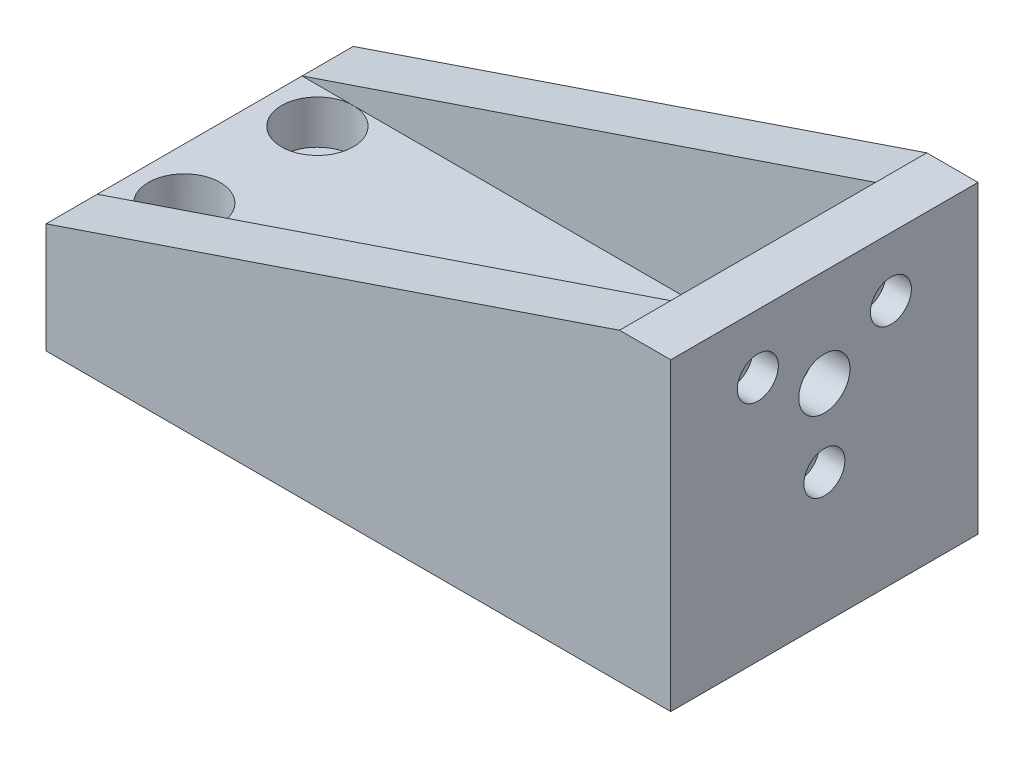
ISO-10303-21;
HEADER;
FILE_DESCRIPTION(('STEP AP214'),'2;1');
FILE_NAME('part.step','',(''),(''),'','','');
FILE_SCHEMA(('AUTOMOTIVE_DESIGN { 1 0 10303 214 1 1 1 1 }'));
ENDSEC;
DATA;
#1=APPLICATION_CONTEXT('core data for automotive mechanical design processes');
#2=APPLICATION_PROTOCOL_DEFINITION('international standard','automotive_design',2000,#1);
#3=PRODUCT_CONTEXT('',#1,'mechanical');
#4=PRODUCT('Part','Part','',(#3));
#5=PRODUCT_RELATED_PRODUCT_CATEGORY('part','',(#4));
#6=PRODUCT_DEFINITION_FORMATION('','',#4);
#7=PRODUCT_DEFINITION_CONTEXT('part definition',#1,'design');
#8=PRODUCT_DEFINITION('design','',#6,#7);
#9=PRODUCT_DEFINITION_SHAPE('','',#8);
#10=(LENGTH_UNIT() NAMED_UNIT(*) SI_UNIT(.MILLI.,.METRE.));
#11=(NAMED_UNIT(*) PLANE_ANGLE_UNIT() SI_UNIT($,.RADIAN.));
#12=(NAMED_UNIT(*) SI_UNIT($,.STERADIAN.) SOLID_ANGLE_UNIT());
#13=UNCERTAINTY_MEASURE_WITH_UNIT(LENGTH_MEASURE(1.E-05),#10,'distance_accuracy_value','');
#14=(GEOMETRIC_REPRESENTATION_CONTEXT(3) GLOBAL_UNCERTAINTY_ASSIGNED_CONTEXT((#13)) GLOBAL_UNIT_ASSIGNED_CONTEXT((#10,
#11,#12)) REPRESENTATION_CONTEXT('',''));
#15=CARTESIAN_POINT('',(0.,0.,0.));
#16=DIRECTION('',(0.,0.,1.));
#17=DIRECTION('',(1.,0.,0.));
#18=AXIS2_PLACEMENT_3D('',#15,#16,#17);
#19=CARTESIAN_POINT('',(-5.,0.,0.));
#20=DIRECTION('',(1.,0.,0.));
#21=DIRECTION('',(0.,0.,-1.));
#22=AXIS2_PLACEMENT_3D('',#19,#20,#21);
#23=CYLINDRICAL_SURFACE('',#22,2.5);
#24=CARTESIAN_POINT('',(0.,0.,0.));
#25=DIRECTION('',(1.,0.,0.));
#26=DIRECTION('',(0.,0.,-1.));
#27=AXIS2_PLACEMENT_3D('',#24,#25,#26);
#28=CIRCLE('',#27,2.5);
#29=CARTESIAN_POINT('',(0.,0.,-2.5));
#30=VERTEX_POINT('',#29);
#31=EDGE_CURVE('E166',#30,#30,#28,.T.);
#32=ORIENTED_EDGE('',*,*,#31,.T.);
#33=EDGE_LOOP('',(#32));
#34=FACE_BOUND('',#33,.T.);
#35=CARTESIAN_POINT('',(-3.5,0.,0.));
#36=DIRECTION('',(-1.,0.,0.));
#37=DIRECTION('',(0.,0.,1.));
#38=AXIS2_PLACEMENT_3D('',#35,#36,#37);
#39=CIRCLE('',#38,2.5);
#40=CARTESIAN_POINT('',(-3.5,0.,2.5));
#41=VERTEX_POINT('',#40);
#42=EDGE_CURVE('E43',#41,#41,#39,.F.);
#43=ORIENTED_EDGE('',*,*,#42,.F.);
#44=EDGE_LOOP('',(#43));
#45=FACE_BOUND('',#44,.T.);
#46=ADVANCED_FACE('F39',(#34,#45),#23,.F.);
#47=CARTESIAN_POINT('',(-5.,0.,0.));
#48=DIRECTION('',(-1.,0.,0.));
#49=DIRECTION('',(0.,0.,1.));
#50=AXIS2_PLACEMENT_3D('',#47,#48,#49);
#51=PLANE('',#50);
#52=CARTESIAN_POINT('',(-5.,0.,0.));
#53=DIRECTION('',(-1.,0.,0.));
#54=DIRECTION('',(0.,0.,1.));
#55=AXIS2_PLACEMENT_3D('',#52,#53,#54);
#56=CIRCLE('',#55,6.25);
#57=CARTESIAN_POINT('',(-5.,0.,6.25));
#58=VERTEX_POINT('',#57);
#59=EDGE_CURVE('E691',#58,#58,#56,.T.);
#60=ORIENTED_EDGE('',*,*,#59,.F.);
#61=EDGE_LOOP('',(#60));
#62=FACE_BOUND('',#61,.T.);
#63=CARTESIAN_POINT('',(-5.,3.75000000000008,6.49519052838324));
#64=DIRECTION('',(1.,0.,0.));
#65=DIRECTION('',(0.,0.,-1.));
#66=AXIS2_PLACEMENT_3D('',#63,#64,#65);
#67=CIRCLE('',#66,1.);
#68=CARTESIAN_POINT('',(-5.,3.75000000000008,5.49519052838324));
#69=VERTEX_POINT('',#68);
#70=EDGE_CURVE('E197',#69,#69,#67,.T.);
#71=ORIENTED_EDGE('',*,*,#70,.T.);
#72=EDGE_LOOP('',(#71));
#73=FACE_BOUND('',#72,.T.);
#74=CARTESIAN_POINT('',(-5.,-7.5,0.));
#75=DIRECTION('',(1.,0.,0.));
#76=DIRECTION('',(0.,0.,-1.));
#77=AXIS2_PLACEMENT_3D('',#74,#75,#76);
#78=CIRCLE('',#77,1.);
#79=CARTESIAN_POINT('',(-5.,-7.5,-0.999999999999948));
#80=VERTEX_POINT('',#79);
#81=EDGE_CURVE('E202',#80,#80,#78,.T.);
#82=ORIENTED_EDGE('',*,*,#81,.T.);
#83=EDGE_LOOP('',(#82));
#84=FACE_BOUND('',#83,.T.);
#85=CARTESIAN_POINT('',(-5.,3.74999999999998,-6.4951905283833));
#86=DIRECTION('',(1.,0.,0.));
#87=DIRECTION('',(0.,0.,-1.));
#88=AXIS2_PLACEMENT_3D('',#85,#86,#87);
#89=CIRCLE('',#88,1.);
#90=CARTESIAN_POINT('',(-5.,3.74999999999998,-7.4951905283833));
#91=VERTEX_POINT('',#90);
#92=EDGE_CURVE('E208',#91,#91,#89,.T.);
#93=ORIENTED_EDGE('',*,*,#92,.T.);
#94=EDGE_LOOP('',(#93));
#95=FACE_BOUND('',#94,.T.);
#96=DIRECTION('',(0.,0.,-1.));
#97=VECTOR('',#96,1.);
#98=CARTESIAN_POINT('',(-5.,-9.5,-15.));
#99=LINE('',#98,#97);
#100=CARTESIAN_POINT('',(-5.,-9.5,10.));
#101=VERTEX_POINT('',#100);
#102=CARTESIAN_POINT('',(-5.,-9.5,-10.));
#103=VERTEX_POINT('',#102);
#104=EDGE_CURVE('E148',#101,#103,#99,.T.);
#105=ORIENTED_EDGE('',*,*,#104,.F.);
#106=DIRECTION('',(0.,-1.,0.));
#107=VECTOR('',#106,1.);
#108=CARTESIAN_POINT('',(-5.,9.5,10.));
#109=LINE('',#108,#107);
#110=CARTESIAN_POINT('',(-5.,9.5,10.));
#111=VERTEX_POINT('',#110);
#112=EDGE_CURVE('E120',#111,#101,#109,.T.);
#113=ORIENTED_EDGE('',*,*,#112,.F.);
#114=DIRECTION('',(0.,0.,1.));
#115=VECTOR('',#114,1.);
#116=CARTESIAN_POINT('',(-5.,9.5,15.));
#117=LINE('',#116,#115);
#118=CARTESIAN_POINT('',(-5.,9.5,-10.));
#119=VERTEX_POINT('',#118);
#120=EDGE_CURVE('E146',#119,#111,#117,.T.);
#121=ORIENTED_EDGE('',*,*,#120,.F.);
#122=DIRECTION('',(0.,-1.,0.));
#123=VECTOR('',#122,1.);
#124=CARTESIAN_POINT('',(-5.,9.5,-10.));
#125=LINE('',#124,#123);
#126=EDGE_CURVE('E666',#119,#103,#125,.T.);
#127=ORIENTED_EDGE('',*,*,#126,.T.);
#128=EDGE_LOOP('',(#105,#113,#121,#127));
#129=FACE_BOUND('',#128,.T.);
#130=ADVANCED_FACE('F144',(#62,#73,#84,#95,#129),#51,.T.);
#131=CARTESIAN_POINT('',(-61.,-9.5,-15.));
#132=DIRECTION('',(0.,-1.,0.));
#133=DIRECTION('',(0.,0.,-1.));
#134=AXIS2_PLACEMENT_3D('',#131,#132,#133);
#135=PLANE('',#134);
#136=DIRECTION('',(-1.,0.,0.));
#137=VECTOR('',#136,1.);
#138=CARTESIAN_POINT('',(-5.,-9.5,-10.));
#139=LINE('',#138,#137);
#140=CARTESIAN_POINT('',(-11.,-9.5,-10.));
#141=VERTEX_POINT('',#140);
#142=CARTESIAN_POINT('',(-56.,-9.5,-10.));
#143=VERTEX_POINT('',#142);
#144=EDGE_CURVE('E655',#141,#143,#139,.T.);
#145=ORIENTED_EDGE('',*,*,#144,.T.);
#146=CARTESIAN_POINT('',(-56.,-9.5,-6.5));
#147=DIRECTION('',(0.,1.,0.));
#148=DIRECTION('',(0.,0.,1.));
#149=AXIS2_PLACEMENT_3D('',#146,#147,#148);
#150=CIRCLE('',#149,3.5);
#151=EDGE_CURVE('E55',#143,#143,#150,.T.);
#152=ORIENTED_EDGE('',*,*,#151,.F.);
#153=CARTESIAN_POINT('',(-61.,-9.5,-10.));
#154=VERTEX_POINT('',#153);
#155=EDGE_CURVE('E661',#143,#154,#139,.T.);
#156=ORIENTED_EDGE('',*,*,#155,.T.);
#157=DIRECTION('',(0.,0.,-1.));
#158=VECTOR('',#157,1.);
#159=CARTESIAN_POINT('',(-61.,-9.5,-15.));
#160=LINE('',#159,#158);
#161=CARTESIAN_POINT('',(-61.,-9.5,10.));
#162=VERTEX_POINT('',#161);
#163=EDGE_CURVE('E264',#162,#154,#160,.T.);
#164=ORIENTED_EDGE('',*,*,#163,.F.);
#165=DIRECTION('',(-1.,0.,0.));
#166=VECTOR('',#165,1.);
#167=CARTESIAN_POINT('',(-5.,-9.5,10.));
#168=LINE('',#167,#166);
#169=CARTESIAN_POINT('',(-56.,-9.5,10.));
#170=VERTEX_POINT('',#169);
#171=EDGE_CURVE('E124',#170,#162,#168,.T.);
#172=ORIENTED_EDGE('',*,*,#171,.F.);
#173=CARTESIAN_POINT('',(-56.,-9.5,6.5));
#174=DIRECTION('',(0.,1.,0.));
#175=DIRECTION('',(0.,0.,-1.));
#176=AXIS2_PLACEMENT_3D('',#173,#174,#175);
#177=CIRCLE('',#176,3.5);
#178=EDGE_CURVE('E705',#170,#170,#177,.T.);
#179=ORIENTED_EDGE('',*,*,#178,.F.);
#180=CARTESIAN_POINT('',(-11.,-9.5,10.));
#181=VERTEX_POINT('',#180);
#182=EDGE_CURVE('E679',#181,#170,#168,.T.);
#183=ORIENTED_EDGE('',*,*,#182,.F.);
#184=CARTESIAN_POINT('',(-11.,-9.5,6.5));
#185=DIRECTION('',(0.,1.,0.));
#186=DIRECTION('',(0.,0.,-1.));
#187=AXIS2_PLACEMENT_3D('',#184,#185,#186);
#188=CIRCLE('',#187,3.5);
#189=EDGE_CURVE('E677',#181,#181,#188,.T.);
#190=ORIENTED_EDGE('',*,*,#189,.F.);
#191=EDGE_CURVE('E139',#101,#181,#168,.T.);
#192=ORIENTED_EDGE('',*,*,#191,.F.);
#193=ORIENTED_EDGE('',*,*,#104,.T.);
#194=EDGE_CURVE('E660',#103,#141,#139,.T.);
#195=ORIENTED_EDGE('',*,*,#194,.T.);
#196=CARTESIAN_POINT('',(-11.,-9.5,-6.5));
#197=DIRECTION('',(0.,1.,0.));
#198=DIRECTION('',(0.,0.,1.));
#199=AXIS2_PLACEMENT_3D('',#196,#197,#198);
#200=CIRCLE('',#199,3.5);
#201=EDGE_CURVE('E60',#141,#141,#200,.T.);
#202=ORIENTED_EDGE('',*,*,#201,.F.);
#203=EDGE_LOOP('',(#145,#152,#156,#164,#172,#179,#183,#190,#192,#193,#195,#202));
#204=FACE_BOUND('',#203,.T.);
#205=ADVANCED_FACE('F314',(#204),#135,.F.);
#206=CARTESIAN_POINT('',(-5.,3.74999999999998,-6.4951905283833));
#207=DIRECTION('',(1.,0.,0.));
#208=DIRECTION('',(0.,0.,-1.));
#209=AXIS2_PLACEMENT_3D('',#206,#207,#208);
#210=CYLINDRICAL_SURFACE('',#209,1.);
#211=ORIENTED_EDGE('',*,*,#92,.F.);
#212=EDGE_LOOP('',(#211));
#213=FACE_BOUND('',#212,.T.);
#214=CARTESIAN_POINT('',(-2.5,3.74999999999998,-6.4951905283833));
#215=DIRECTION('',(1.,0.,0.));
#216=DIRECTION('',(0.,0.,-1.));
#217=AXIS2_PLACEMENT_3D('',#214,#215,#216);
#218=CIRCLE('',#217,1.);
#219=CARTESIAN_POINT('',(-2.5,3.74999999999998,-7.4951905283833));
#220=VERTEX_POINT('',#219);
#221=EDGE_CURVE('E194',#220,#220,#218,.F.);
#222=ORIENTED_EDGE('',*,*,#221,.F.);
#223=EDGE_LOOP('',(#222));
#224=FACE_BOUND('',#223,.T.);
#225=ADVANCED_FACE('F318',(#213,#224),#210,.F.);
#226=CARTESIAN_POINT('',(-5.,-7.5,0.));
#227=DIRECTION('',(1.,0.,0.));
#228=DIRECTION('',(0.,0.,-1.));
#229=AXIS2_PLACEMENT_3D('',#226,#227,#228);
#230=CYLINDRICAL_SURFACE('',#229,1.);
#231=ORIENTED_EDGE('',*,*,#81,.F.);
#232=EDGE_LOOP('',(#231));
#233=FACE_BOUND('',#232,.T.);
#234=CARTESIAN_POINT('',(-2.5,-7.5,0.));
#235=DIRECTION('',(1.,0.,0.));
#236=DIRECTION('',(0.,0.,-1.));
#237=AXIS2_PLACEMENT_3D('',#234,#235,#236);
#238=CIRCLE('',#237,1.);
#239=CARTESIAN_POINT('',(-2.5,-7.5,-0.999999999999948));
#240=VERTEX_POINT('',#239);
#241=EDGE_CURVE('E190',#240,#240,#238,.F.);
#242=ORIENTED_EDGE('',*,*,#241,.F.);
#243=EDGE_LOOP('',(#242));
#244=FACE_BOUND('',#243,.T.);
#245=ADVANCED_FACE('F597',(#233,#244),#230,.F.);
#246=CARTESIAN_POINT('',(-5.,3.75000000000008,6.49519052838324));
#247=DIRECTION('',(1.,0.,0.));
#248=DIRECTION('',(0.,0.,-1.));
#249=AXIS2_PLACEMENT_3D('',#246,#247,#248);
#250=CYLINDRICAL_SURFACE('',#249,1.);
#251=ORIENTED_EDGE('',*,*,#70,.F.);
#252=EDGE_LOOP('',(#251));
#253=FACE_BOUND('',#252,.T.);
#254=CARTESIAN_POINT('',(-2.5,3.75000000000008,6.49519052838324));
#255=DIRECTION('',(1.,0.,0.));
#256=DIRECTION('',(0.,0.,-1.));
#257=AXIS2_PLACEMENT_3D('',#254,#255,#256);
#258=CIRCLE('',#257,1.);
#259=CARTESIAN_POINT('',(-2.5,3.75000000000008,5.49519052838324));
#260=VERTEX_POINT('',#259);
#261=EDGE_CURVE('E186',#260,#260,#258,.F.);
#262=ORIENTED_EDGE('',*,*,#261,.F.);
#263=EDGE_LOOP('',(#262));
#264=FACE_BOUND('',#263,.T.);
#265=ADVANCED_FACE('F384',(#253,#264),#250,.F.);
#266=CARTESIAN_POINT('',(-5.,-20.25,-15.));
#267=DIRECTION('',(0.,0.,-1.));
#268=DIRECTION('',(0.,1.,0.));
#269=AXIS2_PLACEMENT_3D('',#266,#267,#268);
#270=PLANE('',#269);
#271=DIRECTION('',(0.946978700315083,0.32129634474976,0.));
#272=VECTOR('',#271,1.);
#273=CARTESIAN_POINT('',(-61.,-9.5,-15.));
#274=LINE('',#273,#272);
#275=CARTESIAN_POINT('',(-61.,-9.5,-15.));
#276=VERTEX_POINT('',#275);
#277=CARTESIAN_POINT('',(-5.,9.5,-15.));
#278=VERTEX_POINT('',#277);
#279=EDGE_CURVE('E138',#276,#278,#274,.T.);
#280=ORIENTED_EDGE('',*,*,#279,.T.);
#281=DIRECTION('',(1.,0.,0.));
#282=VECTOR('',#281,1.);
#283=CARTESIAN_POINT('',(-5.,9.5,-15.));
#284=LINE('',#283,#282);
#285=CARTESIAN_POINT('',(0.,9.5,-15.));
#286=VERTEX_POINT('',#285);
#287=EDGE_CURVE('E160',#278,#286,#284,.T.);
#288=ORIENTED_EDGE('',*,*,#287,.T.);
#289=DIRECTION('',(0.,1.,0.));
#290=VECTOR('',#289,1.);
#291=CARTESIAN_POINT('',(0.,-20.25,-15.));
#292=LINE('',#291,#290);
#293=CARTESIAN_POINT('',(0.,-20.25,-15.));
#294=VERTEX_POINT('',#293);
#295=EDGE_CURVE('E168',#294,#286,#292,.T.);
#296=ORIENTED_EDGE('',*,*,#295,.F.);
#297=DIRECTION('',(1.,0.,0.));
#298=VECTOR('',#297,1.);
#299=CARTESIAN_POINT('',(-5.,-20.25,-15.));
#300=LINE('',#299,#298);
#301=CARTESIAN_POINT('',(-61.,-20.25,-15.));
#302=VERTEX_POINT('',#301);
#303=EDGE_CURVE('E11',#302,#294,#300,.T.);
#304=ORIENTED_EDGE('',*,*,#303,.F.);
#305=DIRECTION('',(0.,-1.,0.));
#306=VECTOR('',#305,1.);
#307=CARTESIAN_POINT('',(-61.,-20.25,-15.));
#308=LINE('',#307,#306);
#309=EDGE_CURVE('E248',#276,#302,#308,.T.);
#310=ORIENTED_EDGE('',*,*,#309,.F.);
#311=EDGE_LOOP('',(#280,#288,#296,#304,#310));
#312=FACE_BOUND('',#311,.T.);
#313=ADVANCED_FACE('F41',(#312),#270,.T.);
#314=CARTESIAN_POINT('',(-5.,-20.25,15.));
#315=DIRECTION('',(0.,-1.,0.));
#316=DIRECTION('',(0.,0.,-1.));
#317=AXIS2_PLACEMENT_3D('',#314,#315,#316);
#318=PLANE('',#317);
#319=CARTESIAN_POINT('',(-55.9999999999999,-20.25,6.5));
#320=DIRECTION('',(0.,-1.,0.));
#321=DIRECTION('',(0.,0.,-1.));
#322=AXIS2_PLACEMENT_3D('',#319,#320,#321);
#323=CIRCLE('',#322,2.);
#324=CARTESIAN_POINT('',(-55.9999999999999,-20.25,4.5));
#325=VERTEX_POINT('',#324);
#326=EDGE_CURVE('E744',#325,#325,#323,.F.);
#327=ORIENTED_EDGE('',*,*,#326,.T.);
#328=EDGE_LOOP('',(#327));
#329=FACE_BOUND('',#328,.T.);
#330=CARTESIAN_POINT('',(-10.9999999999999,-20.25,6.5));
#331=DIRECTION('',(0.,-1.,0.));
#332=DIRECTION('',(0.,0.,-1.));
#333=AXIS2_PLACEMENT_3D('',#330,#331,#332);
#334=CIRCLE('',#333,2.);
#335=CARTESIAN_POINT('',(-10.9999999999999,-20.25,4.5));
#336=VERTEX_POINT('',#335);
#337=EDGE_CURVE('E736',#336,#336,#334,.F.);
#338=ORIENTED_EDGE('',*,*,#337,.T.);
#339=EDGE_LOOP('',(#338));
#340=FACE_BOUND('',#339,.T.);
#341=CARTESIAN_POINT('',(-11.,-20.25,-6.5));
#342=DIRECTION('',(0.,-1.,0.));
#343=DIRECTION('',(0.,0.,-1.));
#344=AXIS2_PLACEMENT_3D('',#341,#342,#343);
#345=CIRCLE('',#344,2.);
#346=CARTESIAN_POINT('',(-11.,-20.25,-8.5));
#347=VERTEX_POINT('',#346);
#348=EDGE_CURVE('E728',#347,#347,#345,.F.);
#349=ORIENTED_EDGE('',*,*,#348,.T.);
#350=EDGE_LOOP('',(#349));
#351=FACE_BOUND('',#350,.T.);
#352=CARTESIAN_POINT('',(-56.,-20.25,-6.5));
#353=DIRECTION('',(0.,-1.,0.));
#354=DIRECTION('',(0.,0.,-1.));
#355=AXIS2_PLACEMENT_3D('',#352,#353,#354);
#356=CIRCLE('',#355,2.);
#357=CARTESIAN_POINT('',(-56.,-20.25,-8.5));
#358=VERTEX_POINT('',#357);
#359=EDGE_CURVE('E720',#358,#358,#356,.F.);
#360=ORIENTED_EDGE('',*,*,#359,.T.);
#361=EDGE_LOOP('',(#360));
#362=FACE_BOUND('',#361,.T.);
#363=DIRECTION('',(0.,0.,-1.));
#364=VECTOR('',#363,1.);
#365=CARTESIAN_POINT('',(0.,-20.25,15.));
#366=LINE('',#365,#364);
#367=CARTESIAN_POINT('',(0.,-20.25,15.));
#368=VERTEX_POINT('',#367);
#369=EDGE_CURVE('E156',#368,#294,#366,.T.);
#370=ORIENTED_EDGE('',*,*,#369,.F.);
#371=DIRECTION('',(1.,0.,0.));
#372=VECTOR('',#371,1.);
#373=CARTESIAN_POINT('',(-5.,-20.25,15.));
#374=LINE('',#373,#372);
#375=CARTESIAN_POINT('',(-61.,-20.25,15.));
#376=VERTEX_POINT('',#375);
#377=EDGE_CURVE('E49',#376,#368,#374,.T.);
#378=ORIENTED_EDGE('',*,*,#377,.F.);
#379=DIRECTION('',(0.,0.,1.));
#380=VECTOR('',#379,1.);
#381=CARTESIAN_POINT('',(-61.,-20.25,-15.));
#382=LINE('',#381,#380);
#383=EDGE_CURVE('E242',#302,#376,#382,.T.);
#384=ORIENTED_EDGE('',*,*,#383,.F.);
#385=ORIENTED_EDGE('',*,*,#303,.T.);
#386=EDGE_LOOP('',(#370,#378,#384,#385));
#387=FACE_BOUND('',#386,.T.);
#388=ADVANCED_FACE('F240',(#329,#340,#351,#362,#387),#318,.T.);
#389=CARTESIAN_POINT('',(-5.,-20.25,15.));
#390=DIRECTION('',(0.,0.,1.));
#391=DIRECTION('',(1.,0.,0.));
#392=AXIS2_PLACEMENT_3D('',#389,#390,#391);
#393=PLANE('',#392);
#394=DIRECTION('',(0.,-1.,0.));
#395=VECTOR('',#394,1.);
#396=CARTESIAN_POINT('',(0.,-20.25,15.));
#397=LINE('',#396,#395);
#398=CARTESIAN_POINT('',(0.,9.5,15.));
#399=VERTEX_POINT('',#398);
#400=EDGE_CURVE('E162',#399,#368,#397,.T.);
#401=ORIENTED_EDGE('',*,*,#400,.F.);
#402=DIRECTION('',(1.,0.,0.));
#403=VECTOR('',#402,1.);
#404=CARTESIAN_POINT('',(-5.,9.5,15.));
#405=LINE('',#404,#403);
#406=CARTESIAN_POINT('',(-5.,9.5,15.));
#407=VERTEX_POINT('',#406);
#408=EDGE_CURVE('E181',#407,#399,#405,.T.);
#409=ORIENTED_EDGE('',*,*,#408,.F.);
#410=DIRECTION('',(0.946978700315083,0.32129634474976,0.));
#411=VECTOR('',#410,1.);
#412=CARTESIAN_POINT('',(-61.,-9.5,15.));
#413=LINE('',#412,#411);
#414=CARTESIAN_POINT('',(-61.,-9.5,15.));
#415=VERTEX_POINT('',#414);
#416=EDGE_CURVE('E133',#415,#407,#413,.T.);
#417=ORIENTED_EDGE('',*,*,#416,.F.);
#418=DIRECTION('',(0.,1.,0.));
#419=VECTOR('',#418,1.);
#420=CARTESIAN_POINT('',(-61.,-20.25,15.));
#421=LINE('',#420,#419);
#422=EDGE_CURVE('E247',#376,#415,#421,.T.);
#423=ORIENTED_EDGE('',*,*,#422,.F.);
#424=ORIENTED_EDGE('',*,*,#377,.T.);
#425=EDGE_LOOP('',(#401,#409,#417,#423,#424));
#426=FACE_BOUND('',#425,.T.);
#427=ADVANCED_FACE('F237',(#426),#393,.T.);
#428=CARTESIAN_POINT('',(-5.,9.5,15.));
#429=DIRECTION('',(0.,1.,0.));
#430=DIRECTION('',(0.,0.,1.));
#431=AXIS2_PLACEMENT_3D('',#428,#429,#430);
#432=PLANE('',#431);
#433=DIRECTION('',(0.,0.,1.));
#434=VECTOR('',#433,1.);
#435=CARTESIAN_POINT('',(0.,9.5,15.));
#436=LINE('',#435,#434);
#437=EDGE_CURVE('E172',#286,#399,#436,.T.);
#438=ORIENTED_EDGE('',*,*,#437,.F.);
#439=ORIENTED_EDGE('',*,*,#287,.F.);
#440=EDGE_CURVE('E154',#278,#119,#117,.T.);
#441=ORIENTED_EDGE('',*,*,#440,.T.);
#442=ORIENTED_EDGE('',*,*,#120,.T.);
#443=DIRECTION('',(0.,0.,1.));
#444=VECTOR('',#443,1.);
#445=CARTESIAN_POINT('',(-5.,9.5,10.));
#446=LINE('',#445,#444);
#447=EDGE_CURVE('E130',#111,#407,#446,.T.);
#448=ORIENTED_EDGE('',*,*,#447,.T.);
#449=ORIENTED_EDGE('',*,*,#408,.T.);
#450=EDGE_LOOP('',(#438,#439,#441,#442,#448,#449));
#451=FACE_BOUND('',#450,.T.);
#452=ADVANCED_FACE('F152',(#451),#432,.T.);
#453=CARTESIAN_POINT('',(0.,0.,0.));
#454=DIRECTION('',(-1.,0.,0.));
#455=DIRECTION('',(0.,0.,1.));
#456=AXIS2_PLACEMENT_3D('',#453,#454,#455);
#457=PLANE('',#456);
#458=CARTESIAN_POINT('',(0.,3.75000000000008,6.49519052838324));
#459=DIRECTION('',(1.,0.,0.));
#460=DIRECTION('',(0.,0.,-1.));
#461=AXIS2_PLACEMENT_3D('',#458,#459,#460);
#462=CIRCLE('',#461,2.);
#463=CARTESIAN_POINT('',(0.,3.75000000000008,4.49519052838324));
#464=VERTEX_POINT('',#463);
#465=EDGE_CURVE('E272',#464,#464,#462,.T.);
#466=ORIENTED_EDGE('',*,*,#465,.F.);
#467=EDGE_LOOP('',(#466));
#468=FACE_BOUND('',#467,.T.);
#469=CARTESIAN_POINT('',(0.,3.74999999999998,-6.4951905283833));
#470=DIRECTION('',(1.,0.,0.));
#471=DIRECTION('',(0.,0.,-1.));
#472=AXIS2_PLACEMENT_3D('',#469,#470,#471);
#473=CIRCLE('',#472,2.);
#474=CARTESIAN_POINT('',(0.,3.74999999999998,-8.4951905283833));
#475=VERTEX_POINT('',#474);
#476=EDGE_CURVE('E280',#475,#475,#473,.T.);
#477=ORIENTED_EDGE('',*,*,#476,.F.);
#478=EDGE_LOOP('',(#477));
#479=FACE_BOUND('',#478,.T.);
#480=CARTESIAN_POINT('',(0.,-7.5,0.));
#481=DIRECTION('',(1.,0.,0.));
#482=DIRECTION('',(0.,0.,-1.));
#483=AXIS2_PLACEMENT_3D('',#480,#481,#482);
#484=CIRCLE('',#483,2.);
#485=CARTESIAN_POINT('',(0.,-7.5,-1.99999999999995));
#486=VERTEX_POINT('',#485);
#487=EDGE_CURVE('E211',#486,#486,#484,.T.);
#488=ORIENTED_EDGE('',*,*,#487,.F.);
#489=EDGE_LOOP('',(#488));
#490=FACE_BOUND('',#489,.T.);
#491=ORIENTED_EDGE('',*,*,#31,.F.);
#492=EDGE_LOOP('',(#491));
#493=FACE_BOUND('',#492,.T.);
#494=ORIENTED_EDGE('',*,*,#295,.T.);
#495=ORIENTED_EDGE('',*,*,#437,.T.);
#496=ORIENTED_EDGE('',*,*,#400,.T.);
#497=ORIENTED_EDGE('',*,*,#369,.T.);
#498=EDGE_LOOP('',(#494,#495,#496,#497));
#499=FACE_BOUND('',#498,.T.);
#500=ADVANCED_FACE('F223',(#468,#479,#490,#493,#499),#457,.F.);
#501=CARTESIAN_POINT('',(-2.5,3.75000000000008,6.49519052838324));
#502=DIRECTION('',(1.,0.,0.));
#503=DIRECTION('',(0.,0.,-1.));
#504=AXIS2_PLACEMENT_3D('',#501,#502,#503);
#505=PLANE('',#504);
#506=CARTESIAN_POINT('',(-2.5,3.75000000000008,6.49519052838324));
#507=DIRECTION('',(1.,0.,0.));
#508=DIRECTION('',(0.,0.,-1.));
#509=AXIS2_PLACEMENT_3D('',#506,#507,#508);
#510=CIRCLE('',#509,2.);
#511=CARTESIAN_POINT('',(-2.5,3.75000000000008,4.49519052838324));
#512=VERTEX_POINT('',#511);
#513=EDGE_CURVE('E191',#512,#512,#510,.T.);
#514=ORIENTED_EDGE('',*,*,#513,.T.);
#515=EDGE_LOOP('',(#514));
#516=FACE_BOUND('',#515,.T.);
#517=ORIENTED_EDGE('',*,*,#261,.T.);
#518=EDGE_LOOP('',(#517));
#519=FACE_BOUND('',#518,.T.);
#520=ADVANCED_FACE('F226',(#516,#519),#505,.T.);
#521=CARTESIAN_POINT('',(-2.5,3.75000000000008,6.49519052838324));
#522=DIRECTION('',(1.,0.,0.));
#523=DIRECTION('',(0.,0.,-1.));
#524=AXIS2_PLACEMENT_3D('',#521,#522,#523);
#525=CYLINDRICAL_SURFACE('',#524,2.);
#526=ORIENTED_EDGE('',*,*,#513,.F.);
#527=EDGE_LOOP('',(#526));
#528=FACE_BOUND('',#527,.T.);
#529=ORIENTED_EDGE('',*,*,#465,.T.);
#530=EDGE_LOOP('',(#529));
#531=FACE_BOUND('',#530,.T.);
#532=ADVANCED_FACE('F306',(#528,#531),#525,.F.);
#533=CARTESIAN_POINT('',(-2.5,-7.5,0.));
#534=DIRECTION('',(1.,0.,0.));
#535=DIRECTION('',(0.,0.,-1.));
#536=AXIS2_PLACEMENT_3D('',#533,#534,#535);
#537=PLANE('',#536);
#538=CARTESIAN_POINT('',(-2.5,-7.5,0.));
#539=DIRECTION('',(1.,0.,0.));
#540=DIRECTION('',(0.,0.,-1.));
#541=AXIS2_PLACEMENT_3D('',#538,#539,#540);
#542=CIRCLE('',#541,2.);
#543=CARTESIAN_POINT('',(-2.5,-7.5,-1.99999999999995));
#544=VERTEX_POINT('',#543);
#545=EDGE_CURVE('E283',#544,#544,#542,.T.);
#546=ORIENTED_EDGE('',*,*,#545,.T.);
#547=EDGE_LOOP('',(#546));
#548=FACE_BOUND('',#547,.T.);
#549=ORIENTED_EDGE('',*,*,#241,.T.);
#550=EDGE_LOOP('',(#549));
#551=FACE_BOUND('',#550,.T.);
#552=ADVANCED_FACE('F296',(#548,#551),#537,.T.);
#553=CARTESIAN_POINT('',(-2.5,-7.5,0.));
#554=DIRECTION('',(1.,0.,0.));
#555=DIRECTION('',(0.,0.,-1.));
#556=AXIS2_PLACEMENT_3D('',#553,#554,#555);
#557=CYLINDRICAL_SURFACE('',#556,2.);
#558=ORIENTED_EDGE('',*,*,#545,.F.);
#559=EDGE_LOOP('',(#558));
#560=FACE_BOUND('',#559,.T.);
#561=ORIENTED_EDGE('',*,*,#487,.T.);
#562=EDGE_LOOP('',(#561));
#563=FACE_BOUND('',#562,.T.);
#564=ADVANCED_FACE('F292',(#560,#563),#557,.F.);
#565=CARTESIAN_POINT('',(-2.5,3.74999999999998,-6.4951905283833));
#566=DIRECTION('',(1.,0.,0.));
#567=DIRECTION('',(0.,0.,-1.));
#568=AXIS2_PLACEMENT_3D('',#565,#566,#567);
#569=PLANE('',#568);
#570=CARTESIAN_POINT('',(-2.5,3.74999999999998,-6.4951905283833));
#571=DIRECTION('',(1.,0.,0.));
#572=DIRECTION('',(0.,0.,-1.));
#573=AXIS2_PLACEMENT_3D('',#570,#571,#572);
#574=CIRCLE('',#573,2.);
#575=CARTESIAN_POINT('',(-2.5,3.74999999999998,-8.4951905283833));
#576=VERTEX_POINT('',#575);
#577=EDGE_CURVE('E276',#576,#576,#574,.T.);
#578=ORIENTED_EDGE('',*,*,#577,.T.);
#579=EDGE_LOOP('',(#578));
#580=FACE_BOUND('',#579,.T.);
#581=ORIENTED_EDGE('',*,*,#221,.T.);
#582=EDGE_LOOP('',(#581));
#583=FACE_BOUND('',#582,.T.);
#584=ADVANCED_FACE('F295',(#580,#583),#569,.T.);
#585=CARTESIAN_POINT('',(-2.5,3.74999999999998,-6.4951905283833));
#586=DIRECTION('',(1.,0.,0.));
#587=DIRECTION('',(0.,0.,-1.));
#588=AXIS2_PLACEMENT_3D('',#585,#586,#587);
#589=CYLINDRICAL_SURFACE('',#588,2.);
#590=ORIENTED_EDGE('',*,*,#577,.F.);
#591=EDGE_LOOP('',(#590));
#592=FACE_BOUND('',#591,.T.);
#593=ORIENTED_EDGE('',*,*,#476,.T.);
#594=EDGE_LOOP('',(#593));
#595=FACE_BOUND('',#594,.T.);
#596=ADVANCED_FACE('F303',(#592,#595),#589,.F.);
#597=CARTESIAN_POINT('',(-61.,0.,0.));
#598=DIRECTION('',(1.,0.,0.));
#599=DIRECTION('',(0.,0.,-1.));
#600=AXIS2_PLACEMENT_3D('',#597,#598,#599);
#601=PLANE('',#600);
#602=ORIENTED_EDGE('',*,*,#309,.T.);
#603=ORIENTED_EDGE('',*,*,#383,.T.);
#604=ORIENTED_EDGE('',*,*,#422,.T.);
#605=EDGE_CURVE('E265',#415,#162,#160,.T.);
#606=ORIENTED_EDGE('',*,*,#605,.T.);
#607=ORIENTED_EDGE('',*,*,#163,.T.);
#608=DIRECTION('',(0.,0.,-1.));
#609=VECTOR('',#608,1.);
#610=CARTESIAN_POINT('',(-61.,-9.5,-10.));
#611=LINE('',#610,#609);
#612=EDGE_CURVE('E254',#154,#276,#611,.T.);
#613=ORIENTED_EDGE('',*,*,#612,.T.);
#614=EDGE_LOOP('',(#602,#603,#604,#606,#607,#613));
#615=FACE_BOUND('',#614,.T.);
#616=ADVANCED_FACE('F251',(#615),#601,.F.);
#617=CARTESIAN_POINT('',(-61.,-9.5,-10.));
#618=DIRECTION('',(-0.32129634474976,0.946978700315083,0.));
#619=DIRECTION('',(-0.946978700315083,-0.32129634474976,0.));
#620=AXIS2_PLACEMENT_3D('',#617,#618,#619);
#621=PLANE('',#620);
#622=ORIENTED_EDGE('',*,*,#279,.F.);
#623=ORIENTED_EDGE('',*,*,#612,.F.);
#624=DIRECTION('',(0.946978700315083,0.32129634474976,0.));
#625=VECTOR('',#624,1.);
#626=CARTESIAN_POINT('',(-61.,-9.5,-10.));
#627=LINE('',#626,#625);
#628=EDGE_CURVE('E665',#154,#119,#627,.T.);
#629=ORIENTED_EDGE('',*,*,#628,.T.);
#630=ORIENTED_EDGE('',*,*,#440,.F.);
#631=EDGE_LOOP('',(#622,#623,#629,#630));
#632=FACE_BOUND('',#631,.T.);
#633=ADVANCED_FACE('F391',(#632),#621,.T.);
#634=CARTESIAN_POINT('',(0.,0.,-10.));
#635=DIRECTION('',(0.,0.,-1.));
#636=DIRECTION('',(-1.,0.,0.));
#637=AXIS2_PLACEMENT_3D('',#634,#635,#636);
#638=PLANE('',#637);
#639=ORIENTED_EDGE('',*,*,#126,.F.);
#640=ORIENTED_EDGE('',*,*,#628,.F.);
#641=ORIENTED_EDGE('',*,*,#155,.F.);
#642=ORIENTED_EDGE('',*,*,#144,.F.);
#643=ORIENTED_EDGE('',*,*,#194,.F.);
#644=EDGE_LOOP('',(#639,#640,#641,#642,#643));
#645=FACE_BOUND('',#644,.T.);
#646=ADVANCED_FACE('F394',(#645),#638,.F.);
#647=CARTESIAN_POINT('',(-61.,-9.5,10.));
#648=DIRECTION('',(0.32129634474976,-0.946978700315083,0.));
#649=DIRECTION('',(0.946978700315083,0.32129634474976,0.));
#650=AXIS2_PLACEMENT_3D('',#647,#648,#649);
#651=PLANE('',#650);
#652=ORIENTED_EDGE('',*,*,#416,.T.);
#653=ORIENTED_EDGE('',*,*,#447,.F.);
#654=DIRECTION('',(0.946978700315083,0.32129634474976,0.));
#655=VECTOR('',#654,1.);
#656=CARTESIAN_POINT('',(-61.,-9.5,10.));
#657=LINE('',#656,#655);
#658=EDGE_CURVE('E115',#162,#111,#657,.T.);
#659=ORIENTED_EDGE('',*,*,#658,.F.);
#660=ORIENTED_EDGE('',*,*,#605,.F.);
#661=EDGE_LOOP('',(#652,#653,#659,#660));
#662=FACE_BOUND('',#661,.T.);
#663=ADVANCED_FACE('F131',(#662),#651,.F.);
#664=CARTESIAN_POINT('',(0.,0.,10.));
#665=DIRECTION('',(0.,0.,1.));
#666=DIRECTION('',(-1.,0.,0.));
#667=AXIS2_PLACEMENT_3D('',#664,#665,#666);
#668=PLANE('',#667);
#669=ORIENTED_EDGE('',*,*,#112,.T.);
#670=ORIENTED_EDGE('',*,*,#191,.T.);
#671=ORIENTED_EDGE('',*,*,#182,.T.);
#672=ORIENTED_EDGE('',*,*,#171,.T.);
#673=ORIENTED_EDGE('',*,*,#658,.T.);
#674=EDGE_LOOP('',(#669,#670,#671,#672,#673));
#675=FACE_BOUND('',#674,.T.);
#676=ADVANCED_FACE('F117',(#675),#668,.F.);
#677=CARTESIAN_POINT('',(-3.5,0.,0.));
#678=DIRECTION('',(-1.,0.,0.));
#679=DIRECTION('',(0.,0.,1.));
#680=AXIS2_PLACEMENT_3D('',#677,#678,#679);
#681=PLANE('',#680);
#682=CARTESIAN_POINT('',(-3.5,0.,0.));
#683=DIRECTION('',(-1.,0.,0.));
#684=DIRECTION('',(0.,0.,1.));
#685=AXIS2_PLACEMENT_3D('',#682,#683,#684);
#686=CIRCLE('',#685,6.25);
#687=CARTESIAN_POINT('',(-3.5,0.,6.25));
#688=VERTEX_POINT('',#687);
#689=EDGE_CURVE('E688',#688,#688,#686,.T.);
#690=ORIENTED_EDGE('',*,*,#689,.T.);
#691=EDGE_LOOP('',(#690));
#692=FACE_BOUND('',#691,.T.);
#693=ORIENTED_EDGE('',*,*,#42,.T.);
#694=EDGE_LOOP('',(#693));
#695=FACE_BOUND('',#694,.T.);
#696=ADVANCED_FACE('F429',(#692,#695),#681,.T.);
#697=CARTESIAN_POINT('',(-3.5,0.,0.));
#698=DIRECTION('',(-1.,0.,0.));
#699=DIRECTION('',(0.,0.,1.));
#700=AXIS2_PLACEMENT_3D('',#697,#698,#699);
#701=CYLINDRICAL_SURFACE('',#700,6.25);
#702=ORIENTED_EDGE('',*,*,#689,.F.);
#703=EDGE_LOOP('',(#702));
#704=FACE_BOUND('',#703,.T.);
#705=ORIENTED_EDGE('',*,*,#59,.T.);
#706=EDGE_LOOP('',(#705));
#707=FACE_BOUND('',#706,.T.);
#708=ADVANCED_FACE('F443',(#704,#707),#701,.F.);
#709=CARTESIAN_POINT('',(-11.,-13.75,-6.5));
#710=DIRECTION('',(0.,1.,0.));
#711=DIRECTION('',(0.,0.,1.));
#712=AXIS2_PLACEMENT_3D('',#709,#710,#711);
#713=CYLINDRICAL_SURFACE('',#712,3.5);
#714=CARTESIAN_POINT('',(-11.,-13.75,-6.5));
#715=DIRECTION('',(0.,1.,0.));
#716=DIRECTION('',(0.,0.,1.));
#717=AXIS2_PLACEMENT_3D('',#714,#715,#716);
#718=CIRCLE('',#717,3.5);
#719=CARTESIAN_POINT('',(-11.,-13.75,-3.));
#720=VERTEX_POINT('',#719);
#721=EDGE_CURVE('E695',#720,#720,#718,.T.);
#722=ORIENTED_EDGE('',*,*,#721,.F.);
#723=EDGE_LOOP('',(#722));
#724=FACE_BOUND('',#723,.T.);
#725=ORIENTED_EDGE('',*,*,#201,.T.);
#726=EDGE_LOOP('',(#725));
#727=FACE_BOUND('',#726,.T.);
#728=ADVANCED_FACE('F452',(#724,#727),#713,.F.);
#729=CARTESIAN_POINT('',(-11.,-13.75,-6.5));
#730=DIRECTION('',(0.,1.,0.));
#731=DIRECTION('',(0.,0.,1.));
#732=AXIS2_PLACEMENT_3D('',#729,#730,#731);
#733=PLANE('',#732);
#734=CARTESIAN_POINT('',(-11.,-13.75,-6.5));
#735=DIRECTION('',(0.,1.,0.));
#736=DIRECTION('',(0.,0.,1.));
#737=AXIS2_PLACEMENT_3D('',#734,#735,#736);
#738=CIRCLE('',#737,2.);
#739=CARTESIAN_POINT('',(-11.,-13.75,-4.5));
#740=VERTEX_POINT('',#739);
#741=EDGE_CURVE('E732',#740,#740,#738,.T.);
#742=ORIENTED_EDGE('',*,*,#741,.F.);
#743=EDGE_LOOP('',(#742));
#744=FACE_BOUND('',#743,.T.);
#745=ORIENTED_EDGE('',*,*,#721,.T.);
#746=EDGE_LOOP('',(#745));
#747=FACE_BOUND('',#746,.T.);
#748=ADVANCED_FACE('F461',(#744,#747),#733,.T.);
#749=CARTESIAN_POINT('',(-56.,-13.75,6.5));
#750=DIRECTION('',(0.,1.,0.));
#751=DIRECTION('',(0.,0.,1.));
#752=AXIS2_PLACEMENT_3D('',#749,#750,#751);
#753=CYLINDRICAL_SURFACE('',#752,3.5);
#754=CARTESIAN_POINT('',(-56.,-13.75,6.5));
#755=DIRECTION('',(0.,1.,0.));
#756=DIRECTION('',(0.,0.,-1.));
#757=AXIS2_PLACEMENT_3D('',#754,#755,#756);
#758=CIRCLE('',#757,3.5);
#759=CARTESIAN_POINT('',(-56.,-13.75,3.));
#760=VERTEX_POINT('',#759);
#761=EDGE_CURVE('E701',#760,#760,#758,.T.);
#762=ORIENTED_EDGE('',*,*,#761,.F.);
#763=EDGE_LOOP('',(#762));
#764=FACE_BOUND('',#763,.T.);
#765=ORIENTED_EDGE('',*,*,#178,.T.);
#766=EDGE_LOOP('',(#765));
#767=FACE_BOUND('',#766,.T.);
#768=ADVANCED_FACE('F471',(#764,#767),#753,.F.);
#769=CARTESIAN_POINT('',(-56.,-13.75,6.5));
#770=DIRECTION('',(0.,-1.,0.));
#771=DIRECTION('',(0.,0.,-1.));
#772=AXIS2_PLACEMENT_3D('',#769,#770,#771);
#773=PLANE('',#772);
#774=CARTESIAN_POINT('',(-55.9999999999999,-13.75,6.5));
#775=DIRECTION('',(0.,1.,0.));
#776=DIRECTION('',(0.,0.,1.));
#777=AXIS2_PLACEMENT_3D('',#774,#775,#776);
#778=CIRCLE('',#777,2.);
#779=CARTESIAN_POINT('',(-55.9999999999999,-13.75,8.5));
#780=VERTEX_POINT('',#779);
#781=EDGE_CURVE('E748',#780,#780,#778,.T.);
#782=ORIENTED_EDGE('',*,*,#781,.F.);
#783=EDGE_LOOP('',(#782));
#784=FACE_BOUND('',#783,.T.);
#785=ORIENTED_EDGE('',*,*,#761,.T.);
#786=EDGE_LOOP('',(#785));
#787=FACE_BOUND('',#786,.T.);
#788=ADVANCED_FACE('F481',(#784,#787),#773,.F.);
#789=CARTESIAN_POINT('',(-11.,-13.75,6.5));
#790=DIRECTION('',(0.,1.,0.));
#791=DIRECTION('',(0.,0.,1.));
#792=AXIS2_PLACEMENT_3D('',#789,#790,#791);
#793=CYLINDRICAL_SURFACE('',#792,3.5);
#794=CARTESIAN_POINT('',(-11.,-13.75,6.5));
#795=DIRECTION('',(0.,1.,0.));
#796=DIRECTION('',(0.,0.,-1.));
#797=AXIS2_PLACEMENT_3D('',#794,#795,#796);
#798=CIRCLE('',#797,3.5);
#799=CARTESIAN_POINT('',(-11.,-13.75,3.));
#800=VERTEX_POINT('',#799);
#801=EDGE_CURVE('E708',#800,#800,#798,.T.);
#802=ORIENTED_EDGE('',*,*,#801,.F.);
#803=EDGE_LOOP('',(#802));
#804=FACE_BOUND('',#803,.T.);
#805=ORIENTED_EDGE('',*,*,#189,.T.);
#806=EDGE_LOOP('',(#805));
#807=FACE_BOUND('',#806,.T.);
#808=ADVANCED_FACE('F490',(#804,#807),#793,.F.);
#809=CARTESIAN_POINT('',(-11.,-13.75,6.5));
#810=DIRECTION('',(0.,-1.,0.));
#811=DIRECTION('',(0.,0.,-1.));
#812=AXIS2_PLACEMENT_3D('',#809,#810,#811);
#813=PLANE('',#812);
#814=CARTESIAN_POINT('',(-10.9999999999999,-13.75,6.5));
#815=DIRECTION('',(0.,1.,0.));
#816=DIRECTION('',(0.,0.,1.));
#817=AXIS2_PLACEMENT_3D('',#814,#815,#816);
#818=CIRCLE('',#817,2.);
#819=CARTESIAN_POINT('',(-10.9999999999999,-13.75,8.5));
#820=VERTEX_POINT('',#819);
#821=EDGE_CURVE('E740',#820,#820,#818,.T.);
#822=ORIENTED_EDGE('',*,*,#821,.F.);
#823=EDGE_LOOP('',(#822));
#824=FACE_BOUND('',#823,.T.);
#825=ORIENTED_EDGE('',*,*,#801,.T.);
#826=EDGE_LOOP('',(#825));
#827=FACE_BOUND('',#826,.T.);
#828=ADVANCED_FACE('F499',(#824,#827),#813,.F.);
#829=CARTESIAN_POINT('',(-56.,-13.75,-6.5));
#830=DIRECTION('',(0.,1.,0.));
#831=DIRECTION('',(0.,0.,1.));
#832=AXIS2_PLACEMENT_3D('',#829,#830,#831);
#833=CYLINDRICAL_SURFACE('',#832,3.5);
#834=CARTESIAN_POINT('',(-56.,-13.75,-6.5));
#835=DIRECTION('',(0.,1.,0.));
#836=DIRECTION('',(0.,0.,1.));
#837=AXIS2_PLACEMENT_3D('',#834,#835,#836);
#838=CIRCLE('',#837,3.5);
#839=CARTESIAN_POINT('',(-56.,-13.75,-3.));
#840=VERTEX_POINT('',#839);
#841=EDGE_CURVE('E714',#840,#840,#838,.T.);
#842=ORIENTED_EDGE('',*,*,#841,.F.);
#843=EDGE_LOOP('',(#842));
#844=FACE_BOUND('',#843,.T.);
#845=ORIENTED_EDGE('',*,*,#151,.T.);
#846=EDGE_LOOP('',(#845));
#847=FACE_BOUND('',#846,.T.);
#848=ADVANCED_FACE('F508',(#844,#847),#833,.F.);
#849=CARTESIAN_POINT('',(-56.,-13.75,-6.5));
#850=DIRECTION('',(0.,1.,0.));
#851=DIRECTION('',(0.,0.,1.));
#852=AXIS2_PLACEMENT_3D('',#849,#850,#851);
#853=PLANE('',#852);
#854=CARTESIAN_POINT('',(-56.,-13.75,-6.5));
#855=DIRECTION('',(0.,1.,0.));
#856=DIRECTION('',(0.,0.,1.));
#857=AXIS2_PLACEMENT_3D('',#854,#855,#856);
#858=CIRCLE('',#857,2.);
#859=CARTESIAN_POINT('',(-56.,-13.75,-4.5));
#860=VERTEX_POINT('',#859);
#861=EDGE_CURVE('E724',#860,#860,#858,.T.);
#862=ORIENTED_EDGE('',*,*,#861,.F.);
#863=EDGE_LOOP('',(#862));
#864=FACE_BOUND('',#863,.T.);
#865=ORIENTED_EDGE('',*,*,#841,.T.);
#866=EDGE_LOOP('',(#865));
#867=FACE_BOUND('',#866,.T.);
#868=ADVANCED_FACE('F517',(#864,#867),#853,.T.);
#869=CARTESIAN_POINT('',(-56.,-25.9068542494924,-6.5));
#870=DIRECTION('',(0.,1.,0.));
#871=DIRECTION('',(0.,0.,1.));
#872=AXIS2_PLACEMENT_3D('',#869,#870,#871);
#873=CYLINDRICAL_SURFACE('',#872,2.);
#874=ORIENTED_EDGE('',*,*,#861,.T.);
#875=EDGE_LOOP('',(#874));
#876=FACE_BOUND('',#875,.T.);
#877=ORIENTED_EDGE('',*,*,#359,.F.);
#878=EDGE_LOOP('',(#877));
#879=FACE_BOUND('',#878,.T.);
#880=ADVANCED_FACE('F525',(#876,#879),#873,.F.);
#881=CARTESIAN_POINT('',(-11.,-25.9068542494924,-6.5));
#882=DIRECTION('',(0.,1.,0.));
#883=DIRECTION('',(0.,0.,1.));
#884=AXIS2_PLACEMENT_3D('',#881,#882,#883);
#885=CYLINDRICAL_SURFACE('',#884,2.);
#886=ORIENTED_EDGE('',*,*,#741,.T.);
#887=EDGE_LOOP('',(#886));
#888=FACE_BOUND('',#887,.T.);
#889=ORIENTED_EDGE('',*,*,#348,.F.);
#890=EDGE_LOOP('',(#889));
#891=FACE_BOUND('',#890,.T.);
#892=ADVANCED_FACE('F534',(#888,#891),#885,.F.);
#893=CARTESIAN_POINT('',(-10.9999999999999,-25.9068542494924,6.5));
#894=DIRECTION('',(0.,1.,0.));
#895=DIRECTION('',(0.,0.,1.));
#896=AXIS2_PLACEMENT_3D('',#893,#894,#895);
#897=CYLINDRICAL_SURFACE('',#896,2.);
#898=ORIENTED_EDGE('',*,*,#821,.T.);
#899=EDGE_LOOP('',(#898));
#900=FACE_BOUND('',#899,.T.);
#901=ORIENTED_EDGE('',*,*,#337,.F.);
#902=EDGE_LOOP('',(#901));
#903=FACE_BOUND('',#902,.T.);
#904=ADVANCED_FACE('F543',(#900,#903),#897,.F.);
#905=CARTESIAN_POINT('',(-55.9999999999999,-25.9068542494924,6.5));
#906=DIRECTION('',(0.,1.,0.));
#907=DIRECTION('',(0.,0.,1.));
#908=AXIS2_PLACEMENT_3D('',#905,#906,#907);
#909=CYLINDRICAL_SURFACE('',#908,2.);
#910=ORIENTED_EDGE('',*,*,#781,.T.);
#911=EDGE_LOOP('',(#910));
#912=FACE_BOUND('',#911,.T.);
#913=ORIENTED_EDGE('',*,*,#326,.F.);
#914=EDGE_LOOP('',(#913));
#915=FACE_BOUND('',#914,.T.);
#916=ADVANCED_FACE('F552',(#912,#915),#909,.F.);
#917=CLOSED_SHELL('',(#46,#130,#205,#225,#245,#265,#313,#388,#427,#452,#500,#520,#532,#552,#564,
#584,#596,#616,#633,#646,#663,#676,#696,#708,#728,#748,#768,#788,#808,#828,#848,#868,#880,#892,
#904,#916));
#918=MANIFOLD_SOLID_BREP('B2',#917);
#919=ADVANCED_BREP_SHAPE_REPRESENTATION('',(#18,#918),#14);
#920=SHAPE_DEFINITION_REPRESENTATION(#9,#919);
ENDSEC;
END-ISO-10303-21;
